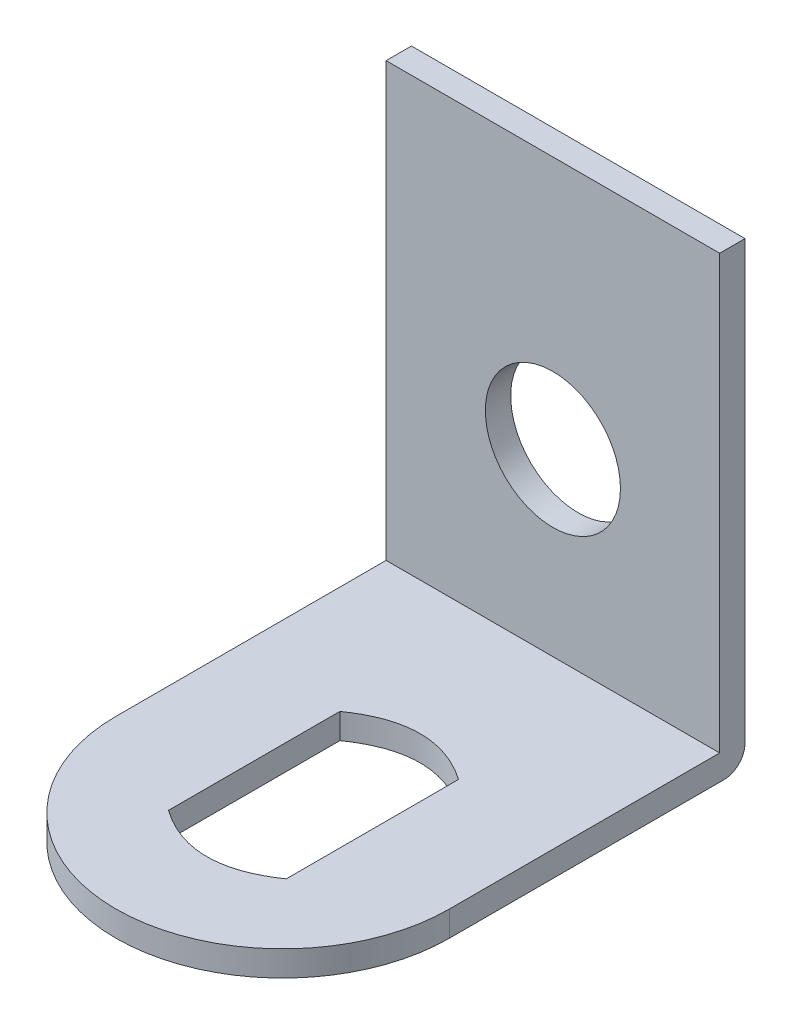
ISO-10303-21;
HEADER;
FILE_DESCRIPTION(('STEP AP214'),'2;1');
FILE_NAME('part.step','',(''),(''),'','','');
FILE_SCHEMA(('AUTOMOTIVE_DESIGN { 1 0 10303 214 1 1 1 1 }'));
ENDSEC;
DATA;
#1=APPLICATION_CONTEXT('core data for automotive mechanical design processes');
#2=APPLICATION_PROTOCOL_DEFINITION('international standard','automotive_design',2000,#1);
#3=PRODUCT_CONTEXT('',#1,'mechanical');
#4=PRODUCT('Part','Part','',(#3));
#5=PRODUCT_RELATED_PRODUCT_CATEGORY('part','',(#4));
#6=PRODUCT_DEFINITION_FORMATION('','',#4);
#7=PRODUCT_DEFINITION_CONTEXT('part definition',#1,'design');
#8=PRODUCT_DEFINITION('design','',#6,#7);
#9=PRODUCT_DEFINITION_SHAPE('','',#8);
#10=(LENGTH_UNIT() NAMED_UNIT(*) SI_UNIT(.MILLI.,.METRE.));
#11=(NAMED_UNIT(*) PLANE_ANGLE_UNIT() SI_UNIT($,.RADIAN.));
#12=(NAMED_UNIT(*) SI_UNIT($,.STERADIAN.) SOLID_ANGLE_UNIT());
#13=UNCERTAINTY_MEASURE_WITH_UNIT(LENGTH_MEASURE(1.E-05),#10,'distance_accuracy_value','');
#14=(GEOMETRIC_REPRESENTATION_CONTEXT(3) GLOBAL_UNCERTAINTY_ASSIGNED_CONTEXT((#13)) GLOBAL_UNIT_ASSIGNED_CONTEXT((#10,
#11,#12)) REPRESENTATION_CONTEXT('',''));
#15=CARTESIAN_POINT('',(0.,0.,0.));
#16=DIRECTION('',(0.,0.,1.));
#17=DIRECTION('',(1.,0.,0.));
#18=AXIS2_PLACEMENT_3D('',#15,#16,#17);
#19=CARTESIAN_POINT('',(-7.9,1.,1.));
#20=DIRECTION('',(1.,0.,0.));
#21=DIRECTION('',(0.,0.,-1.));
#22=AXIS2_PLACEMENT_3D('',#19,#20,#21);
#23=CYLINDRICAL_SURFACE('',#22,1.);
#24=DIRECTION('',(1.,0.,0.));
#25=VECTOR('',#24,1.);
#26=CARTESIAN_POINT('',(-7.9,0.,1.));
#27=LINE('',#26,#25);
#28=CARTESIAN_POINT('',(-7.9,0.,1.));
#29=VERTEX_POINT('',#28);
#30=CARTESIAN_POINT('',(7.9,0.,1.));
#31=VERTEX_POINT('',#30);
#32=EDGE_CURVE('E241',#29,#31,#27,.T.);
#33=ORIENTED_EDGE('',*,*,#32,.F.);
#34=CARTESIAN_POINT('',(-7.9,1.,1.));
#35=DIRECTION('',(-1.,0.,0.));
#36=DIRECTION('',(0.,0.,1.));
#37=AXIS2_PLACEMENT_3D('',#34,#35,#36);
#38=CIRCLE('',#37,1.);
#39=CARTESIAN_POINT('',(-7.9,1.,0.));
#40=VERTEX_POINT('',#39);
#41=EDGE_CURVE('E41',#40,#29,#38,.T.);
#42=ORIENTED_EDGE('',*,*,#41,.F.);
#43=DIRECTION('',(1.,0.,0.));
#44=VECTOR('',#43,1.);
#45=CARTESIAN_POINT('',(-7.9,1.,0.));
#46=LINE('',#45,#44);
#47=CARTESIAN_POINT('',(7.9,1.,0.));
#48=VERTEX_POINT('',#47);
#49=EDGE_CURVE('E244',#48,#40,#46,.F.);
#50=ORIENTED_EDGE('',*,*,#49,.F.);
#51=CARTESIAN_POINT('',(7.9,1.,1.));
#52=DIRECTION('',(-1.,0.,0.));
#53=DIRECTION('',(0.,0.,1.));
#54=AXIS2_PLACEMENT_3D('',#51,#52,#53);
#55=CIRCLE('',#54,1.);
#56=EDGE_CURVE('E11',#31,#48,#55,.F.);
#57=ORIENTED_EDGE('',*,*,#56,.F.);
#58=EDGE_LOOP('',(#33,#42,#50,#57));
#59=FACE_BOUND('',#58,.T.);
#60=ADVANCED_FACE('F34',(#59),#23,.T.);
#61=CARTESIAN_POINT('',(0.,1.2,14.));
#62=DIRECTION('',(0.,-1.,0.));
#63=DIRECTION('',(0.,0.,-1.));
#64=AXIS2_PLACEMENT_3D('',#61,#62,#63);
#65=CYLINDRICAL_SURFACE('',#64,7.9);
#66=DIRECTION('',(0.,1.,0.));
#67=VECTOR('',#66,1.);
#68=CARTESIAN_POINT('',(7.9,1.2,14.));
#69=LINE('',#68,#67);
#70=CARTESIAN_POINT('',(7.9,1.2,14.));
#71=VERTEX_POINT('',#70);
#72=CARTESIAN_POINT('',(7.9,0.,14.));
#73=VERTEX_POINT('',#72);
#74=EDGE_CURVE('E194',#71,#73,#69,.F.);
#75=ORIENTED_EDGE('',*,*,#74,.F.);
#76=CARTESIAN_POINT('',(0.,1.2,14.));
#77=DIRECTION('',(0.,1.,0.));
#78=DIRECTION('',(0.,0.,1.));
#79=AXIS2_PLACEMENT_3D('',#76,#77,#78);
#80=CIRCLE('',#79,7.9);
#81=CARTESIAN_POINT('',(-7.9,1.2,14.));
#82=VERTEX_POINT('',#81);
#83=EDGE_CURVE('E197',#82,#71,#80,.T.);
#84=ORIENTED_EDGE('',*,*,#83,.F.);
#85=DIRECTION('',(0.,-1.,0.));
#86=VECTOR('',#85,1.);
#87=CARTESIAN_POINT('',(-7.9,0.,14.));
#88=LINE('',#87,#86);
#89=CARTESIAN_POINT('',(-7.9,0.,14.));
#90=VERTEX_POINT('',#89);
#91=EDGE_CURVE('E201',#90,#82,#88,.F.);
#92=ORIENTED_EDGE('',*,*,#91,.F.);
#93=CARTESIAN_POINT('',(0.,0.,14.));
#94=DIRECTION('',(0.,-1.,0.));
#95=DIRECTION('',(0.,0.,-1.));
#96=AXIS2_PLACEMENT_3D('',#93,#94,#95);
#97=CIRCLE('',#96,7.9);
#98=EDGE_CURVE('E199',#73,#90,#97,.T.);
#99=ORIENTED_EDGE('',*,*,#98,.F.);
#100=EDGE_LOOP('',(#75,#84,#92,#99));
#101=FACE_BOUND('',#100,.T.);
#102=ADVANCED_FACE('F182',(#101),#65,.T.);
#103=CARTESIAN_POINT('',(-7.9,0.,0.));
#104=DIRECTION('',(0.,0.,-1.));
#105=DIRECTION('',(0.,1.,0.));
#106=AXIS2_PLACEMENT_3D('',#103,#104,#105);
#107=PLANE('',#106);
#108=CARTESIAN_POINT('',(0.,9.7,0.));
#109=DIRECTION('',(0.,0.,1.));
#110=DIRECTION('',(1.,0.,0.));
#111=AXIS2_PLACEMENT_3D('',#108,#109,#110);
#112=CIRCLE('',#111,3.2);
#113=CARTESIAN_POINT('',(3.2,9.7,0.));
#114=VERTEX_POINT('',#113);
#115=EDGE_CURVE('E275',#114,#114,#112,.T.);
#116=ORIENTED_EDGE('',*,*,#115,.T.);
#117=EDGE_LOOP('',(#116));
#118=FACE_BOUND('',#117,.T.);
#119=DIRECTION('',(0.,1.,0.));
#120=VECTOR('',#119,1.);
#121=CARTESIAN_POINT('',(7.9,0.,0.));
#122=LINE('',#121,#120);
#123=CARTESIAN_POINT('',(7.9,21.7,0.));
#124=VERTEX_POINT('',#123);
#125=EDGE_CURVE('E255',#48,#124,#122,.T.);
#126=ORIENTED_EDGE('',*,*,#125,.F.);
#127=ORIENTED_EDGE('',*,*,#49,.T.);
#128=DIRECTION('',(0.,1.,0.));
#129=VECTOR('',#128,1.);
#130=CARTESIAN_POINT('',(-7.9,0.,0.));
#131=LINE('',#130,#129);
#132=CARTESIAN_POINT('',(-7.9,21.7,0.));
#133=VERTEX_POINT('',#132);
#134=EDGE_CURVE('E213',#40,#133,#131,.T.);
#135=ORIENTED_EDGE('',*,*,#134,.T.);
#136=DIRECTION('',(1.,0.,0.));
#137=VECTOR('',#136,1.);
#138=CARTESIAN_POINT('',(-7.9,21.7,0.));
#139=LINE('',#138,#137);
#140=EDGE_CURVE('E232',#133,#124,#139,.T.);
#141=ORIENTED_EDGE('',*,*,#140,.T.);
#142=EDGE_LOOP('',(#126,#127,#135,#141));
#143=FACE_BOUND('',#142,.T.);
#144=ADVANCED_FACE('F170',(#118,#143),#107,.T.);
#145=CARTESIAN_POINT('',(-7.9,0.,0.));
#146=DIRECTION('',(0.,-1.,0.));
#147=DIRECTION('',(0.,0.,-1.));
#148=AXIS2_PLACEMENT_3D('',#145,#146,#147);
#149=PLANE('',#148);
#150=CARTESIAN_POINT('',(2.8,0.,8.47012978384816));
#151=CARTESIAN_POINT('',(-0.00627724253544975,0.,6.5198257789732));
#152=CARTESIAN_POINT('',(-2.8,0.,8.49025885857899));
#153=B_SPLINE_CURVE_WITH_KNOTS('',2,(#150,#151,#152),.UNSPECIFIED.,.F.,.F.,(3,3),(0.,1.),.UNSPECIFIED.);
#154=CARTESIAN_POINT('',(2.8,0.,8.47012978384816));
#155=VERTEX_POINT('',#154);
#156=CARTESIAN_POINT('',(-2.8,0.,8.49025885857899));
#157=VERTEX_POINT('',#156);
#158=EDGE_CURVE('E117',#155,#157,#153,.T.);
#159=ORIENTED_EDGE('',*,*,#158,.T.);
#160=DIRECTION('',(0.,0.,1.));
#161=VECTOR('',#160,1.);
#162=CARTESIAN_POINT('',(-2.8,0.,8.49025885857899));
#163=LINE('',#162,#161);
#164=CARTESIAN_POINT('',(-2.8,0.,16.609741141421));
#165=VERTEX_POINT('',#164);
#166=EDGE_CURVE('E129',#157,#165,#163,.T.);
#167=ORIENTED_EDGE('',*,*,#166,.T.);
#168=CARTESIAN_POINT('',(-2.8,0.,16.609741141421));
#169=CARTESIAN_POINT('',(-0.00627724253544817,0.,18.5801742210268));
#170=CARTESIAN_POINT('',(2.8,0.,16.6298702161518));
#171=B_SPLINE_CURVE_WITH_KNOTS('',2,(#168,#169,#170),.UNSPECIFIED.,.F.,.F.,(3,3),(0.,1.),.UNSPECIFIED.);
#172=CARTESIAN_POINT('',(2.8,0.,16.6298702161518));
#173=VERTEX_POINT('',#172);
#174=EDGE_CURVE('E133',#165,#173,#171,.T.);
#175=ORIENTED_EDGE('',*,*,#174,.T.);
#176=DIRECTION('',(0.,0.,-1.));
#177=VECTOR('',#176,1.);
#178=CARTESIAN_POINT('',(2.8,0.,8.47012978384816));
#179=LINE('',#178,#177);
#180=EDGE_CURVE('E125',#173,#155,#179,.T.);
#181=ORIENTED_EDGE('',*,*,#180,.T.);
#182=EDGE_LOOP('',(#159,#167,#175,#181));
#183=FACE_BOUND('',#182,.T.);
#184=DIRECTION('',(0.,0.,-1.));
#185=VECTOR('',#184,1.);
#186=CARTESIAN_POINT('',(-7.9,0.,0.));
#187=LINE('',#186,#185);
#188=EDGE_CURVE('E229',#90,#29,#187,.T.);
#189=ORIENTED_EDGE('',*,*,#188,.T.);
#190=ORIENTED_EDGE('',*,*,#32,.T.);
#191=DIRECTION('',(0.,0.,-1.));
#192=VECTOR('',#191,1.);
#193=CARTESIAN_POINT('',(7.9,0.,0.));
#194=LINE('',#193,#192);
#195=EDGE_CURVE('E211',#73,#31,#194,.T.);
#196=ORIENTED_EDGE('',*,*,#195,.F.);
#197=ORIENTED_EDGE('',*,*,#98,.T.);
#198=EDGE_LOOP('',(#189,#190,#196,#197));
#199=FACE_BOUND('',#198,.T.);
#200=ADVANCED_FACE('F135',(#183,#199),#149,.T.);
#201=CARTESIAN_POINT('',(-7.9,1.2,21.9));
#202=DIRECTION('',(0.,1.,0.));
#203=DIRECTION('',(0.,0.,1.));
#204=AXIS2_PLACEMENT_3D('',#201,#202,#203);
#205=PLANE('',#204);
#206=CARTESIAN_POINT('',(2.8,1.2,8.47012978384816));
#207=CARTESIAN_POINT('',(-0.00627724253544975,1.2,6.5198257789732));
#208=CARTESIAN_POINT('',(-2.8,1.2,8.49025885857899));
#209=B_SPLINE_CURVE_WITH_KNOTS('',2,(#206,#207,#208),.UNSPECIFIED.,.F.,.F.,(3,3),(0.,1.),.UNSPECIFIED.);
#210=CARTESIAN_POINT('',(2.8,1.2,8.47012978384816));
#211=VERTEX_POINT('',#210);
#212=CARTESIAN_POINT('',(-2.8,1.2,8.49025885857899));
#213=VERTEX_POINT('',#212);
#214=EDGE_CURVE('E120',#211,#213,#209,.T.);
#215=ORIENTED_EDGE('',*,*,#214,.F.);
#216=DIRECTION('',(0.,0.,-1.));
#217=VECTOR('',#216,1.);
#218=CARTESIAN_POINT('',(2.8,1.2,8.47012978384816));
#219=LINE('',#218,#217);
#220=CARTESIAN_POINT('',(2.8,1.2,16.6298702161518));
#221=VERTEX_POINT('',#220);
#222=EDGE_CURVE('E138',#221,#211,#219,.T.);
#223=ORIENTED_EDGE('',*,*,#222,.F.);
#224=CARTESIAN_POINT('',(-2.8,1.2,16.609741141421));
#225=CARTESIAN_POINT('',(-0.00627724253544817,1.2,18.5801742210268));
#226=CARTESIAN_POINT('',(2.8,1.2,16.6298702161518));
#227=B_SPLINE_CURVE_WITH_KNOTS('',2,(#224,#225,#226),.UNSPECIFIED.,.F.,.F.,(3,3),(0.,1.),.UNSPECIFIED.);
#228=CARTESIAN_POINT('',(-2.8,1.2,16.609741141421));
#229=VERTEX_POINT('',#228);
#230=EDGE_CURVE('E141',#229,#221,#227,.T.);
#231=ORIENTED_EDGE('',*,*,#230,.F.);
#232=DIRECTION('',(0.,0.,1.));
#233=VECTOR('',#232,1.);
#234=CARTESIAN_POINT('',(-2.8,1.2,8.49025885857899));
#235=LINE('',#234,#233);
#236=EDGE_CURVE('E267',#213,#229,#235,.T.);
#237=ORIENTED_EDGE('',*,*,#236,.F.);
#238=EDGE_LOOP('',(#215,#223,#231,#237));
#239=FACE_BOUND('',#238,.T.);
#240=DIRECTION('',(0.,0.,1.));
#241=VECTOR('',#240,1.);
#242=CARTESIAN_POINT('',(-7.9,1.2,21.9));
#243=LINE('',#242,#241);
#244=CARTESIAN_POINT('',(-7.9,1.2,1.2));
#245=VERTEX_POINT('',#244);
#246=EDGE_CURVE('E226',#245,#82,#243,.T.);
#247=ORIENTED_EDGE('',*,*,#246,.T.);
#248=ORIENTED_EDGE('',*,*,#83,.T.);
#249=DIRECTION('',(0.,0.,1.));
#250=VECTOR('',#249,1.);
#251=CARTESIAN_POINT('',(7.9,1.2,21.9));
#252=LINE('',#251,#250);
#253=CARTESIAN_POINT('',(7.9,1.2,1.2));
#254=VERTEX_POINT('',#253);
#255=EDGE_CURVE('E206',#254,#71,#252,.T.);
#256=ORIENTED_EDGE('',*,*,#255,.F.);
#257=DIRECTION('',(1.,0.,0.));
#258=VECTOR('',#257,1.);
#259=CARTESIAN_POINT('',(-7.9,1.2,1.2));
#260=LINE('',#259,#258);
#261=EDGE_CURVE('E202',#245,#254,#260,.T.);
#262=ORIENTED_EDGE('',*,*,#261,.F.);
#263=EDGE_LOOP('',(#247,#248,#256,#262));
#264=FACE_BOUND('',#263,.T.);
#265=ADVANCED_FACE('F169',(#239,#264),#205,.T.);
#266=CARTESIAN_POINT('',(-7.9,1.2,1.2));
#267=DIRECTION('',(0.,0.,1.));
#268=DIRECTION('',(0.,-1.,0.));
#269=AXIS2_PLACEMENT_3D('',#266,#267,#268);
#270=PLANE('',#269);
#271=CARTESIAN_POINT('',(0.,9.7,1.2));
#272=DIRECTION('',(0.,0.,1.));
#273=DIRECTION('',(1.,0.,0.));
#274=AXIS2_PLACEMENT_3D('',#271,#272,#273);
#275=CIRCLE('',#274,3.2);
#276=CARTESIAN_POINT('',(3.2,9.7,1.2));
#277=VERTEX_POINT('',#276);
#278=EDGE_CURVE('E147',#277,#277,#275,.T.);
#279=ORIENTED_EDGE('',*,*,#278,.F.);
#280=EDGE_LOOP('',(#279));
#281=FACE_BOUND('',#280,.T.);
#282=ORIENTED_EDGE('',*,*,#261,.T.);
#283=DIRECTION('',(0.,-1.,0.));
#284=VECTOR('',#283,1.);
#285=CARTESIAN_POINT('',(7.9,1.2,1.2));
#286=LINE('',#285,#284);
#287=CARTESIAN_POINT('',(7.9,21.7,1.2));
#288=VERTEX_POINT('',#287);
#289=EDGE_CURVE('E209',#288,#254,#286,.T.);
#290=ORIENTED_EDGE('',*,*,#289,.F.);
#291=DIRECTION('',(1.,0.,0.));
#292=VECTOR('',#291,1.);
#293=CARTESIAN_POINT('',(-7.9,21.7,1.2));
#294=LINE('',#293,#292);
#295=CARTESIAN_POINT('',(-7.9,21.7,1.2));
#296=VERTEX_POINT('',#295);
#297=EDGE_CURVE('E234',#296,#288,#294,.T.);
#298=ORIENTED_EDGE('',*,*,#297,.F.);
#299=DIRECTION('',(0.,-1.,0.));
#300=VECTOR('',#299,1.);
#301=CARTESIAN_POINT('',(-7.9,1.2,1.2));
#302=LINE('',#301,#300);
#303=EDGE_CURVE('E223',#296,#245,#302,.T.);
#304=ORIENTED_EDGE('',*,*,#303,.T.);
#305=EDGE_LOOP('',(#282,#290,#298,#304));
#306=FACE_BOUND('',#305,.T.);
#307=ADVANCED_FACE('F173',(#281,#306),#270,.T.);
#308=CARTESIAN_POINT('',(-7.9,21.7,1.2));
#309=DIRECTION('',(0.,1.,0.));
#310=DIRECTION('',(0.,0.,1.));
#311=AXIS2_PLACEMENT_3D('',#308,#309,#310);
#312=PLANE('',#311);
#313=ORIENTED_EDGE('',*,*,#297,.T.);
#314=DIRECTION('',(0.,0.,1.));
#315=VECTOR('',#314,1.);
#316=CARTESIAN_POINT('',(7.9,21.7,1.2));
#317=LINE('',#316,#315);
#318=EDGE_CURVE('E215',#124,#288,#317,.T.);
#319=ORIENTED_EDGE('',*,*,#318,.F.);
#320=ORIENTED_EDGE('',*,*,#140,.F.);
#321=DIRECTION('',(0.,0.,1.));
#322=VECTOR('',#321,1.);
#323=CARTESIAN_POINT('',(-7.9,21.7,1.2));
#324=LINE('',#323,#322);
#325=EDGE_CURVE('E220',#133,#296,#324,.T.);
#326=ORIENTED_EDGE('',*,*,#325,.T.);
#327=EDGE_LOOP('',(#313,#319,#320,#326));
#328=FACE_BOUND('',#327,.T.);
#329=ADVANCED_FACE('F165',(#328),#312,.T.);
#330=CARTESIAN_POINT('',(-7.9,0.,0.));
#331=DIRECTION('',(-1.,0.,0.));
#332=DIRECTION('',(0.,0.,1.));
#333=AXIS2_PLACEMENT_3D('',#330,#331,#332);
#334=PLANE('',#333);
#335=ORIENTED_EDGE('',*,*,#134,.F.);
#336=ORIENTED_EDGE('',*,*,#41,.T.);
#337=ORIENTED_EDGE('',*,*,#188,.F.);
#338=ORIENTED_EDGE('',*,*,#91,.T.);
#339=ORIENTED_EDGE('',*,*,#246,.F.);
#340=ORIENTED_EDGE('',*,*,#303,.F.);
#341=ORIENTED_EDGE('',*,*,#325,.F.);
#342=EDGE_LOOP('',(#335,#336,#337,#338,#339,#340,#341));
#343=FACE_BOUND('',#342,.T.);
#344=ADVANCED_FACE('F162',(#343),#334,.T.);
#345=CARTESIAN_POINT('',(7.9,0.,0.));
#346=DIRECTION('',(-1.,0.,0.));
#347=DIRECTION('',(0.,0.,1.));
#348=AXIS2_PLACEMENT_3D('',#345,#346,#347);
#349=PLANE('',#348);
#350=ORIENTED_EDGE('',*,*,#195,.T.);
#351=ORIENTED_EDGE('',*,*,#56,.T.);
#352=ORIENTED_EDGE('',*,*,#125,.T.);
#353=ORIENTED_EDGE('',*,*,#318,.T.);
#354=ORIENTED_EDGE('',*,*,#289,.T.);
#355=ORIENTED_EDGE('',*,*,#255,.T.);
#356=ORIENTED_EDGE('',*,*,#74,.T.);
#357=EDGE_LOOP('',(#350,#351,#352,#353,#354,#355,#356));
#358=FACE_BOUND('',#357,.T.);
#359=ADVANCED_FACE('F158',(#358),#349,.F.);
#360=DIRECTION('',(0.,1.,0.));
#361=VECTOR('',#360,1.);
#362=SURFACE_OF_LINEAR_EXTRUSION('',#153,#361);
#363=ORIENTED_EDGE('',*,*,#214,.T.);
#364=DIRECTION('',(0.,1.,0.));
#365=VECTOR('',#364,1.);
#366=CARTESIAN_POINT('',(-2.8,0.,8.49025885857899));
#367=LINE('',#366,#365);
#368=EDGE_CURVE('E113',#157,#213,#367,.T.);
#369=ORIENTED_EDGE('',*,*,#368,.F.);
#370=ORIENTED_EDGE('',*,*,#158,.F.);
#371=DIRECTION('',(0.,1.,0.));
#372=VECTOR('',#371,1.);
#373=CARTESIAN_POINT('',(2.8,0.,8.47012978384816));
#374=LINE('',#373,#372);
#375=EDGE_CURVE('E256',#155,#211,#374,.T.);
#376=ORIENTED_EDGE('',*,*,#375,.T.);
#377=EDGE_LOOP('',(#363,#369,#370,#376));
#378=FACE_BOUND('',#377,.T.);
#379=ADVANCED_FACE('F115',(#378),#362,.F.);
#380=CARTESIAN_POINT('',(2.8,0.,8.47012978384816));
#381=DIRECTION('',(1.,0.,0.));
#382=DIRECTION('',(0.,0.,-1.));
#383=AXIS2_PLACEMENT_3D('',#380,#381,#382);
#384=PLANE('',#383);
#385=ORIENTED_EDGE('',*,*,#222,.T.);
#386=ORIENTED_EDGE('',*,*,#375,.F.);
#387=ORIENTED_EDGE('',*,*,#180,.F.);
#388=DIRECTION('',(0.,1.,0.));
#389=VECTOR('',#388,1.);
#390=CARTESIAN_POINT('',(2.8,0.,16.6298702161518));
#391=LINE('',#390,#389);
#392=EDGE_CURVE('E258',#173,#221,#391,.T.);
#393=ORIENTED_EDGE('',*,*,#392,.T.);
#394=EDGE_LOOP('',(#385,#386,#387,#393));
#395=FACE_BOUND('',#394,.T.);
#396=ADVANCED_FACE('F157',(#395),#384,.F.);
#397=DIRECTION('',(0.,1.,0.));
#398=VECTOR('',#397,1.);
#399=SURFACE_OF_LINEAR_EXTRUSION('',#171,#398);
#400=ORIENTED_EDGE('',*,*,#230,.T.);
#401=ORIENTED_EDGE('',*,*,#392,.F.);
#402=ORIENTED_EDGE('',*,*,#174,.F.);
#403=DIRECTION('',(0.,1.,0.));
#404=VECTOR('',#403,1.);
#405=CARTESIAN_POINT('',(-2.8,0.,16.609741141421));
#406=LINE('',#405,#404);
#407=EDGE_CURVE('E124',#165,#229,#406,.T.);
#408=ORIENTED_EDGE('',*,*,#407,.T.);
#409=EDGE_LOOP('',(#400,#401,#402,#408));
#410=FACE_BOUND('',#409,.T.);
#411=ADVANCED_FACE('F285',(#410),#399,.F.);
#412=CARTESIAN_POINT('',(-2.8,0.,8.49025885857899));
#413=DIRECTION('',(-1.,0.,0.));
#414=DIRECTION('',(0.,0.,1.));
#415=AXIS2_PLACEMENT_3D('',#412,#413,#414);
#416=PLANE('',#415);
#417=ORIENTED_EDGE('',*,*,#236,.T.);
#418=ORIENTED_EDGE('',*,*,#407,.F.);
#419=ORIENTED_EDGE('',*,*,#166,.F.);
#420=ORIENTED_EDGE('',*,*,#368,.T.);
#421=EDGE_LOOP('',(#417,#418,#419,#420));
#422=FACE_BOUND('',#421,.T.);
#423=ADVANCED_FACE('F130',(#422),#416,.F.);
#424=CARTESIAN_POINT('',(0.,9.7,0.));
#425=DIRECTION('',(0.,0.,1.));
#426=DIRECTION('',(1.,0.,0.));
#427=AXIS2_PLACEMENT_3D('',#424,#425,#426);
#428=CYLINDRICAL_SURFACE('',#427,3.2);
#429=ORIENTED_EDGE('',*,*,#115,.F.);
#430=EDGE_LOOP('',(#429));
#431=FACE_BOUND('',#430,.T.);
#432=ORIENTED_EDGE('',*,*,#278,.T.);
#433=EDGE_LOOP('',(#432));
#434=FACE_BOUND('',#433,.T.);
#435=ADVANCED_FACE('F292',(#431,#434),#428,.F.);
#436=CLOSED_SHELL('',(#60,#102,#144,#200,#265,#307,#329,#344,#359,#379,#396,#411,#423,#435));
#437=MANIFOLD_SOLID_BREP('B2',#436);
#438=ADVANCED_BREP_SHAPE_REPRESENTATION('',(#18,#437),#14);
#439=SHAPE_DEFINITION_REPRESENTATION(#9,#438);
ENDSEC;
END-ISO-10303-21;
